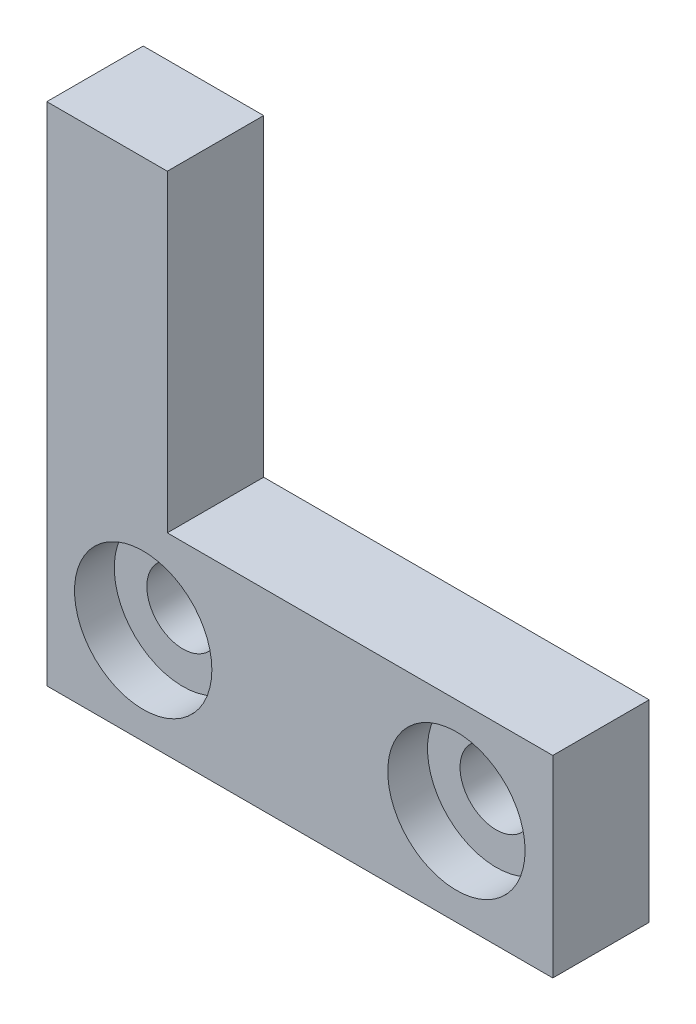
ISO-10303-21;
HEADER;
FILE_DESCRIPTION(('STEP AP214'),'2;1');
FILE_NAME('part.step','',(''),(''),'','','');
FILE_SCHEMA(('AUTOMOTIVE_DESIGN { 1 0 10303 214 1 1 1 1 }'));
ENDSEC;
DATA;
#1=APPLICATION_CONTEXT('core data for automotive mechanical design processes');
#2=APPLICATION_PROTOCOL_DEFINITION('international standard','automotive_design',2000,#1);
#3=PRODUCT_CONTEXT('',#1,'mechanical');
#4=PRODUCT('Part','Part','',(#3));
#5=PRODUCT_RELATED_PRODUCT_CATEGORY('part','',(#4));
#6=PRODUCT_DEFINITION_FORMATION('','',#4);
#7=PRODUCT_DEFINITION_CONTEXT('part definition',#1,'design');
#8=PRODUCT_DEFINITION('design','',#6,#7);
#9=PRODUCT_DEFINITION_SHAPE('','',#8);
#10=(LENGTH_UNIT() NAMED_UNIT(*) SI_UNIT(.MILLI.,.METRE.));
#11=(NAMED_UNIT(*) PLANE_ANGLE_UNIT() SI_UNIT($,.RADIAN.));
#12=(NAMED_UNIT(*) SI_UNIT($,.STERADIAN.) SOLID_ANGLE_UNIT());
#13=UNCERTAINTY_MEASURE_WITH_UNIT(LENGTH_MEASURE(1.E-05),#10,'distance_accuracy_value','');
#14=(GEOMETRIC_REPRESENTATION_CONTEXT(3) GLOBAL_UNCERTAINTY_ASSIGNED_CONTEXT((#13)) GLOBAL_UNIT_ASSIGNED_CONTEXT((#10,
#11,#12)) REPRESENTATION_CONTEXT('',''));
#15=CARTESIAN_POINT('',(0.,0.,0.));
#16=DIRECTION('',(0.,0.,1.));
#17=DIRECTION('',(1.,0.,0.));
#18=AXIS2_PLACEMENT_3D('',#15,#16,#17);
#19=CARTESIAN_POINT('',(14.,-79.0000000000002,4.));
#20=DIRECTION('',(0.,0.,-1.));
#21=DIRECTION('',(-1.,0.,0.));
#22=AXIS2_PLACEMENT_3D('',#19,#20,#21);
#23=CYLINDRICAL_SURFACE('',#22,1.5);
#24=CARTESIAN_POINT('',(14.,-79.0000000000002,0.));
#25=DIRECTION('',(0.,0.,1.));
#26=DIRECTION('',(1.,0.,0.));
#27=AXIS2_PLACEMENT_3D('',#24,#25,#26);
#28=CIRCLE('',#27,1.5);
#29=CARTESIAN_POINT('',(15.5,-79.0000000000002,0.));
#30=VERTEX_POINT('',#29);
#31=EDGE_CURVE('E122',#30,#30,#28,.T.);
#32=ORIENTED_EDGE('',*,*,#31,.F.);
#33=EDGE_LOOP('',(#32));
#34=FACE_BOUND('',#33,.T.);
#35=CARTESIAN_POINT('',(14.,-79.0000000000002,2.35));
#36=DIRECTION('',(0.,0.,1.));
#37=DIRECTION('',(1.,0.,0.));
#38=AXIS2_PLACEMENT_3D('',#35,#36,#37);
#39=CIRCLE('',#38,1.5);
#40=CARTESIAN_POINT('',(15.5,-79.0000000000002,2.35));
#41=VERTEX_POINT('',#40);
#42=EDGE_CURVE('E38',#41,#41,#39,.T.);
#43=ORIENTED_EDGE('',*,*,#42,.T.);
#44=EDGE_LOOP('',(#43));
#45=FACE_BOUND('',#44,.T.);
#46=ADVANCED_FACE('F35',(#34,#45),#23,.F.);
#47=CARTESIAN_POINT('',(0.999999999999993,-79.0000000000002,4.));
#48=DIRECTION('',(0.,0.,-1.));
#49=DIRECTION('',(-1.,0.,0.));
#50=AXIS2_PLACEMENT_3D('',#47,#48,#49);
#51=CYLINDRICAL_SURFACE('',#50,1.5);
#52=CARTESIAN_POINT('',(0.999999999999993,-79.0000000000002,0.));
#53=DIRECTION('',(0.,0.,1.));
#54=DIRECTION('',(1.,0.,0.));
#55=AXIS2_PLACEMENT_3D('',#52,#53,#54);
#56=CIRCLE('',#55,1.5);
#57=CARTESIAN_POINT('',(2.49999999999999,-79.0000000000002,0.));
#58=VERTEX_POINT('',#57);
#59=EDGE_CURVE('E130',#58,#58,#56,.T.);
#60=ORIENTED_EDGE('',*,*,#59,.F.);
#61=EDGE_LOOP('',(#60));
#62=FACE_BOUND('',#61,.T.);
#63=CARTESIAN_POINT('',(0.999999999999993,-79.0000000000002,2.35));
#64=DIRECTION('',(0.,0.,1.));
#65=DIRECTION('',(1.,0.,0.));
#66=AXIS2_PLACEMENT_3D('',#63,#64,#65);
#67=CIRCLE('',#66,1.5);
#68=CARTESIAN_POINT('',(2.49999999999999,-79.0000000000002,2.35));
#69=VERTEX_POINT('',#68);
#70=EDGE_CURVE('E137',#69,#69,#67,.T.);
#71=ORIENTED_EDGE('',*,*,#70,.T.);
#72=EDGE_LOOP('',(#71));
#73=FACE_BOUND('',#72,.T.);
#74=ADVANCED_FACE('F171',(#62,#73),#51,.F.);
#75=CARTESIAN_POINT('',(0.,-75.0000000000002,4.));
#76=DIRECTION('',(0.,1.,0.));
#77=DIRECTION('',(0.,0.,1.));
#78=AXIS2_PLACEMENT_3D('',#75,#76,#77);
#79=PLANE('',#78);
#80=DIRECTION('',(1.,0.,0.));
#81=VECTOR('',#80,1.);
#82=CARTESIAN_POINT('',(0.,-75.0000000000002,0.));
#83=LINE('',#82,#81);
#84=CARTESIAN_POINT('',(1.99999999999999,-75.0000000000002,0.));
#85=VERTEX_POINT('',#84);
#86=CARTESIAN_POINT('',(18.,-75.0000000000002,0.));
#87=VERTEX_POINT('',#86);
#88=EDGE_CURVE('E118',#85,#87,#83,.T.);
#89=ORIENTED_EDGE('',*,*,#88,.F.);
#90=DIRECTION('',(0.,0.,-1.));
#91=VECTOR('',#90,1.);
#92=CARTESIAN_POINT('',(1.99999999999999,-75.0000000000002,4.));
#93=LINE('',#92,#91);
#94=CARTESIAN_POINT('',(1.99999999999999,-75.0000000000002,4.));
#95=VERTEX_POINT('',#94);
#96=EDGE_CURVE('E103',#95,#85,#93,.T.);
#97=ORIENTED_EDGE('',*,*,#96,.F.);
#98=DIRECTION('',(1.,0.,0.));
#99=VECTOR('',#98,1.);
#100=CARTESIAN_POINT('',(0.,-75.0000000000002,4.));
#101=LINE('',#100,#99);
#102=CARTESIAN_POINT('',(18.,-75.0000000000002,4.));
#103=VERTEX_POINT('',#102);
#104=EDGE_CURVE('E133',#95,#103,#101,.T.);
#105=ORIENTED_EDGE('',*,*,#104,.T.);
#106=DIRECTION('',(0.,0.,-1.));
#107=VECTOR('',#106,1.);
#108=CARTESIAN_POINT('',(18.,-75.0000000000002,4.));
#109=LINE('',#108,#107);
#110=EDGE_CURVE('E53',#103,#87,#109,.T.);
#111=ORIENTED_EDGE('',*,*,#110,.T.);
#112=EDGE_LOOP('',(#89,#97,#105,#111));
#113=FACE_BOUND('',#112,.T.);
#114=ADVANCED_FACE('F201',(#113),#79,.T.);
#115=CARTESIAN_POINT('',(0.,-62.0000000000002,4.));
#116=DIRECTION('',(0.,-1.,0.));
#117=DIRECTION('',(0.,0.,-1.));
#118=AXIS2_PLACEMENT_3D('',#115,#116,#117);
#119=PLANE('',#118);
#120=DIRECTION('',(-1.,0.,0.));
#121=VECTOR('',#120,1.);
#122=CARTESIAN_POINT('',(0.,-62.0000000000002,4.));
#123=LINE('',#122,#121);
#124=CARTESIAN_POINT('',(1.99999999999999,-62.0000000000002,4.));
#125=VERTEX_POINT('',#124);
#126=CARTESIAN_POINT('',(-3.00000000000001,-62.0000000000002,4.));
#127=VERTEX_POINT('',#126);
#128=EDGE_CURVE('E81',#125,#127,#123,.T.);
#129=ORIENTED_EDGE('',*,*,#128,.F.);
#130=DIRECTION('',(0.,0.,1.));
#131=VECTOR('',#130,1.);
#132=CARTESIAN_POINT('',(1.99999999999999,-62.0000000000002,4.));
#133=LINE('',#132,#131);
#134=CARTESIAN_POINT('',(1.99999999999999,-62.0000000000002,0.));
#135=VERTEX_POINT('',#134);
#136=EDGE_CURVE('E101',#135,#125,#133,.T.);
#137=ORIENTED_EDGE('',*,*,#136,.F.);
#138=DIRECTION('',(-1.,0.,0.));
#139=VECTOR('',#138,1.);
#140=CARTESIAN_POINT('',(0.,-62.0000000000002,0.));
#141=LINE('',#140,#139);
#142=CARTESIAN_POINT('',(-3.00000000000001,-62.0000000000002,0.));
#143=VERTEX_POINT('',#142);
#144=EDGE_CURVE('E110',#135,#143,#141,.T.);
#145=ORIENTED_EDGE('',*,*,#144,.T.);
#146=DIRECTION('',(0.,0.,-1.));
#147=VECTOR('',#146,1.);
#148=CARTESIAN_POINT('',(-3.00000000000001,-62.0000000000002,4.));
#149=LINE('',#148,#147);
#150=EDGE_CURVE('E11',#127,#143,#149,.T.);
#151=ORIENTED_EDGE('',*,*,#150,.F.);
#152=EDGE_LOOP('',(#129,#137,#145,#151));
#153=FACE_BOUND('',#152,.T.);
#154=ADVANCED_FACE('F109',(#153),#119,.F.);
#155=CARTESIAN_POINT('',(-3.00000000000001,0.,4.));
#156=DIRECTION('',(-1.,0.,0.));
#157=DIRECTION('',(0.,0.,1.));
#158=AXIS2_PLACEMENT_3D('',#155,#156,#157);
#159=PLANE('',#158);
#160=DIRECTION('',(0.,1.,0.));
#161=VECTOR('',#160,1.);
#162=CARTESIAN_POINT('',(-3.00000000000001,0.,0.));
#163=LINE('',#162,#161);
#164=CARTESIAN_POINT('',(-3.00000000000001,-83.0000000000002,0.));
#165=VERTEX_POINT('',#164);
#166=EDGE_CURVE('E117',#165,#143,#163,.T.);
#167=ORIENTED_EDGE('',*,*,#166,.F.);
#168=DIRECTION('',(0.,0.,-1.));
#169=VECTOR('',#168,1.);
#170=CARTESIAN_POINT('',(-3.00000000000001,-83.0000000000002,4.));
#171=LINE('',#170,#169);
#172=CARTESIAN_POINT('',(-3.00000000000001,-83.0000000000002,4.));
#173=VERTEX_POINT('',#172);
#174=EDGE_CURVE('E44',#173,#165,#171,.T.);
#175=ORIENTED_EDGE('',*,*,#174,.F.);
#176=DIRECTION('',(0.,1.,0.));
#177=VECTOR('',#176,1.);
#178=CARTESIAN_POINT('',(-3.00000000000001,0.,4.));
#179=LINE('',#178,#177);
#180=EDGE_CURVE('E160',#173,#127,#179,.T.);
#181=ORIENTED_EDGE('',*,*,#180,.T.);
#182=ORIENTED_EDGE('',*,*,#150,.T.);
#183=EDGE_LOOP('',(#167,#175,#181,#182));
#184=FACE_BOUND('',#183,.T.);
#185=ADVANCED_FACE('F206',(#184),#159,.T.);
#186=CARTESIAN_POINT('',(0.,-83.0000000000002,4.));
#187=DIRECTION('',(0.,1.,0.));
#188=DIRECTION('',(0.,0.,1.));
#189=AXIS2_PLACEMENT_3D('',#186,#187,#188);
#190=PLANE('',#189);
#191=DIRECTION('',(1.,0.,0.));
#192=VECTOR('',#191,1.);
#193=CARTESIAN_POINT('',(0.,-83.0000000000002,0.));
#194=LINE('',#193,#192);
#195=CARTESIAN_POINT('',(18.,-83.0000000000002,0.));
#196=VERTEX_POINT('',#195);
#197=EDGE_CURVE('E120',#165,#196,#194,.T.);
#198=ORIENTED_EDGE('',*,*,#197,.T.);
#199=DIRECTION('',(0.,0.,-1.));
#200=VECTOR('',#199,1.);
#201=CARTESIAN_POINT('',(18.,-83.0000000000002,4.));
#202=LINE('',#201,#200);
#203=CARTESIAN_POINT('',(18.,-83.0000000000002,4.));
#204=VERTEX_POINT('',#203);
#205=EDGE_CURVE('E69',#204,#196,#202,.T.);
#206=ORIENTED_EDGE('',*,*,#205,.F.);
#207=DIRECTION('',(1.,0.,0.));
#208=VECTOR('',#207,1.);
#209=CARTESIAN_POINT('',(0.,-83.0000000000002,4.));
#210=LINE('',#209,#208);
#211=EDGE_CURVE('E163',#173,#204,#210,.T.);
#212=ORIENTED_EDGE('',*,*,#211,.F.);
#213=ORIENTED_EDGE('',*,*,#174,.T.);
#214=EDGE_LOOP('',(#198,#206,#212,#213));
#215=FACE_BOUND('',#214,.T.);
#216=ADVANCED_FACE('F196',(#215),#190,.F.);
#217=CARTESIAN_POINT('',(18.,0.,4.));
#218=DIRECTION('',(1.,0.,0.));
#219=DIRECTION('',(0.,0.,-1.));
#220=AXIS2_PLACEMENT_3D('',#217,#218,#219);
#221=PLANE('',#220);
#222=DIRECTION('',(0.,-1.,0.));
#223=VECTOR('',#222,1.);
#224=CARTESIAN_POINT('',(18.,0.,0.));
#225=LINE('',#224,#223);
#226=EDGE_CURVE('E127',#87,#196,#225,.T.);
#227=ORIENTED_EDGE('',*,*,#226,.F.);
#228=ORIENTED_EDGE('',*,*,#110,.F.);
#229=DIRECTION('',(0.,-1.,0.));
#230=VECTOR('',#229,1.);
#231=CARTESIAN_POINT('',(18.,0.,4.));
#232=LINE('',#231,#230);
#233=EDGE_CURVE('E135',#103,#204,#232,.T.);
#234=ORIENTED_EDGE('',*,*,#233,.T.);
#235=ORIENTED_EDGE('',*,*,#205,.T.);
#236=EDGE_LOOP('',(#227,#228,#234,#235));
#237=FACE_BOUND('',#236,.T.);
#238=ADVANCED_FACE('F189',(#237),#221,.T.);
#239=CARTESIAN_POINT('',(0.,0.,4.));
#240=DIRECTION('',(0.,0.,1.));
#241=DIRECTION('',(1.,0.,0.));
#242=AXIS2_PLACEMENT_3D('',#239,#240,#241);
#243=PLANE('',#242);
#244=DIRECTION('',(0.,1.,0.));
#245=VECTOR('',#244,1.);
#246=CARTESIAN_POINT('',(1.99999999999999,-80.0000000000002,4.));
#247=LINE('',#246,#245);
#248=EDGE_CURVE('E106',#95,#125,#247,.T.);
#249=ORIENTED_EDGE('',*,*,#248,.T.);
#250=ORIENTED_EDGE('',*,*,#128,.T.);
#251=ORIENTED_EDGE('',*,*,#180,.F.);
#252=ORIENTED_EDGE('',*,*,#211,.T.);
#253=ORIENTED_EDGE('',*,*,#233,.F.);
#254=ORIENTED_EDGE('',*,*,#104,.F.);
#255=EDGE_LOOP('',(#249,#250,#251,#252,#253,#254));
#256=FACE_BOUND('',#255,.T.);
#257=CARTESIAN_POINT('',(0.999999999999993,-79.0000000000002,4.));
#258=DIRECTION('',(0.,0.,1.));
#259=DIRECTION('',(1.,0.,0.));
#260=AXIS2_PLACEMENT_3D('',#257,#258,#259);
#261=CIRCLE('',#260,2.85);
#262=CARTESIAN_POINT('',(3.84999999999999,-79.0000000000002,4.));
#263=VERTEX_POINT('',#262);
#264=EDGE_CURVE('E144',#263,#263,#261,.T.);
#265=ORIENTED_EDGE('',*,*,#264,.F.);
#266=EDGE_LOOP('',(#265));
#267=FACE_BOUND('',#266,.T.);
#268=CARTESIAN_POINT('',(14.,-79.0000000000002,4.));
#269=DIRECTION('',(0.,0.,1.));
#270=DIRECTION('',(1.,0.,0.));
#271=AXIS2_PLACEMENT_3D('',#268,#269,#270);
#272=CIRCLE('',#271,2.85);
#273=CARTESIAN_POINT('',(16.85,-79.0000000000002,4.));
#274=VERTEX_POINT('',#273);
#275=EDGE_CURVE('E155',#274,#274,#272,.T.);
#276=ORIENTED_EDGE('',*,*,#275,.F.);
#277=EDGE_LOOP('',(#276));
#278=FACE_BOUND('',#277,.T.);
#279=ADVANCED_FACE('F187',(#256,#267,#278),#243,.T.);
#280=CARTESIAN_POINT('',(0.,0.,0.));
#281=DIRECTION('',(0.,0.,1.));
#282=DIRECTION('',(1.,0.,0.));
#283=AXIS2_PLACEMENT_3D('',#280,#281,#282);
#284=PLANE('',#283);
#285=ORIENTED_EDGE('',*,*,#31,.T.);
#286=EDGE_LOOP('',(#285));
#287=FACE_BOUND('',#286,.T.);
#288=ORIENTED_EDGE('',*,*,#144,.F.);
#289=DIRECTION('',(0.,1.,0.));
#290=VECTOR('',#289,1.);
#291=CARTESIAN_POINT('',(1.99999999999999,-80.0000000000002,0.));
#292=LINE('',#291,#290);
#293=EDGE_CURVE('E97',#85,#135,#292,.T.);
#294=ORIENTED_EDGE('',*,*,#293,.F.);
#295=ORIENTED_EDGE('',*,*,#88,.T.);
#296=ORIENTED_EDGE('',*,*,#226,.T.);
#297=ORIENTED_EDGE('',*,*,#197,.F.);
#298=ORIENTED_EDGE('',*,*,#166,.T.);
#299=EDGE_LOOP('',(#288,#294,#295,#296,#297,#298));
#300=FACE_BOUND('',#299,.T.);
#301=ORIENTED_EDGE('',*,*,#59,.T.);
#302=EDGE_LOOP('',(#301));
#303=FACE_BOUND('',#302,.T.);
#304=ADVANCED_FACE('F113',(#287,#300,#303),#284,.F.);
#305=CARTESIAN_POINT('',(14.,-79.0000000000002,2.35));
#306=DIRECTION('',(0.,0.,1.));
#307=DIRECTION('',(1.,0.,0.));
#308=AXIS2_PLACEMENT_3D('',#305,#306,#307);
#309=CYLINDRICAL_SURFACE('',#308,2.85);
#310=CARTESIAN_POINT('',(14.,-79.0000000000002,2.35));
#311=DIRECTION('',(0.,0.,1.));
#312=DIRECTION('',(1.,0.,0.));
#313=AXIS2_PLACEMENT_3D('',#310,#311,#312);
#314=CIRCLE('',#313,2.85);
#315=CARTESIAN_POINT('',(16.85,-79.0000000000002,2.35));
#316=VERTEX_POINT('',#315);
#317=EDGE_CURVE('E149',#316,#316,#314,.T.);
#318=ORIENTED_EDGE('',*,*,#317,.F.);
#319=EDGE_LOOP('',(#318));
#320=FACE_BOUND('',#319,.T.);
#321=ORIENTED_EDGE('',*,*,#275,.T.);
#322=EDGE_LOOP('',(#321));
#323=FACE_BOUND('',#322,.T.);
#324=ADVANCED_FACE('F178',(#320,#323),#309,.F.);
#325=CARTESIAN_POINT('',(14.,-79.0000000000002,2.35));
#326=DIRECTION('',(0.,0.,1.));
#327=DIRECTION('',(1.,0.,0.));
#328=AXIS2_PLACEMENT_3D('',#325,#326,#327);
#329=PLANE('',#328);
#330=ORIENTED_EDGE('',*,*,#42,.F.);
#331=EDGE_LOOP('',(#330));
#332=FACE_BOUND('',#331,.T.);
#333=ORIENTED_EDGE('',*,*,#317,.T.);
#334=EDGE_LOOP('',(#333));
#335=FACE_BOUND('',#334,.T.);
#336=ADVANCED_FACE('F174',(#332,#335),#329,.T.);
#337=CARTESIAN_POINT('',(0.999999999999993,-79.0000000000002,2.35));
#338=DIRECTION('',(0.,0.,1.));
#339=DIRECTION('',(1.,0.,0.));
#340=AXIS2_PLACEMENT_3D('',#337,#338,#339);
#341=CYLINDRICAL_SURFACE('',#340,2.85);
#342=CARTESIAN_POINT('',(0.999999999999993,-79.0000000000002,2.35));
#343=DIRECTION('',(0.,0.,1.));
#344=DIRECTION('',(1.,0.,0.));
#345=AXIS2_PLACEMENT_3D('',#342,#343,#344);
#346=CIRCLE('',#345,2.85);
#347=CARTESIAN_POINT('',(3.84999999999999,-79.0000000000002,2.35));
#348=VERTEX_POINT('',#347);
#349=EDGE_CURVE('E139',#348,#348,#346,.T.);
#350=ORIENTED_EDGE('',*,*,#349,.F.);
#351=EDGE_LOOP('',(#350));
#352=FACE_BOUND('',#351,.T.);
#353=ORIENTED_EDGE('',*,*,#264,.T.);
#354=EDGE_LOOP('',(#353));
#355=FACE_BOUND('',#354,.T.);
#356=ADVANCED_FACE('F177',(#352,#355),#341,.F.);
#357=CARTESIAN_POINT('',(0.999999999999993,-79.0000000000002,2.35));
#358=DIRECTION('',(0.,0.,1.));
#359=DIRECTION('',(1.,0.,0.));
#360=AXIS2_PLACEMENT_3D('',#357,#358,#359);
#361=PLANE('',#360);
#362=ORIENTED_EDGE('',*,*,#70,.F.);
#363=EDGE_LOOP('',(#362));
#364=FACE_BOUND('',#363,.T.);
#365=ORIENTED_EDGE('',*,*,#349,.T.);
#366=EDGE_LOOP('',(#365));
#367=FACE_BOUND('',#366,.T.);
#368=ADVANCED_FACE('F269',(#364,#367),#361,.T.);
#369=CARTESIAN_POINT('',(1.99999999999999,-80.0000000000002,4.));
#370=DIRECTION('',(-1.,0.,0.));
#371=DIRECTION('',(0.,0.,1.));
#372=AXIS2_PLACEMENT_3D('',#369,#370,#371);
#373=PLANE('',#372);
#374=ORIENTED_EDGE('',*,*,#96,.T.);
#375=ORIENTED_EDGE('',*,*,#293,.T.);
#376=ORIENTED_EDGE('',*,*,#136,.T.);
#377=ORIENTED_EDGE('',*,*,#248,.F.);
#378=EDGE_LOOP('',(#374,#375,#376,#377));
#379=FACE_BOUND('',#378,.T.);
#380=ADVANCED_FACE('F99',(#379),#373,.F.);
#381=CLOSED_SHELL('',(#46,#74,#114,#154,#185,#216,#238,#279,#304,#324,#336,#356,#368,#380));
#382=MANIFOLD_SOLID_BREP('B2',#381);
#383=ADVANCED_BREP_SHAPE_REPRESENTATION('',(#18,#382),#14);
#384=SHAPE_DEFINITION_REPRESENTATION(#9,#383);
ENDSEC;
END-ISO-10303-21;
